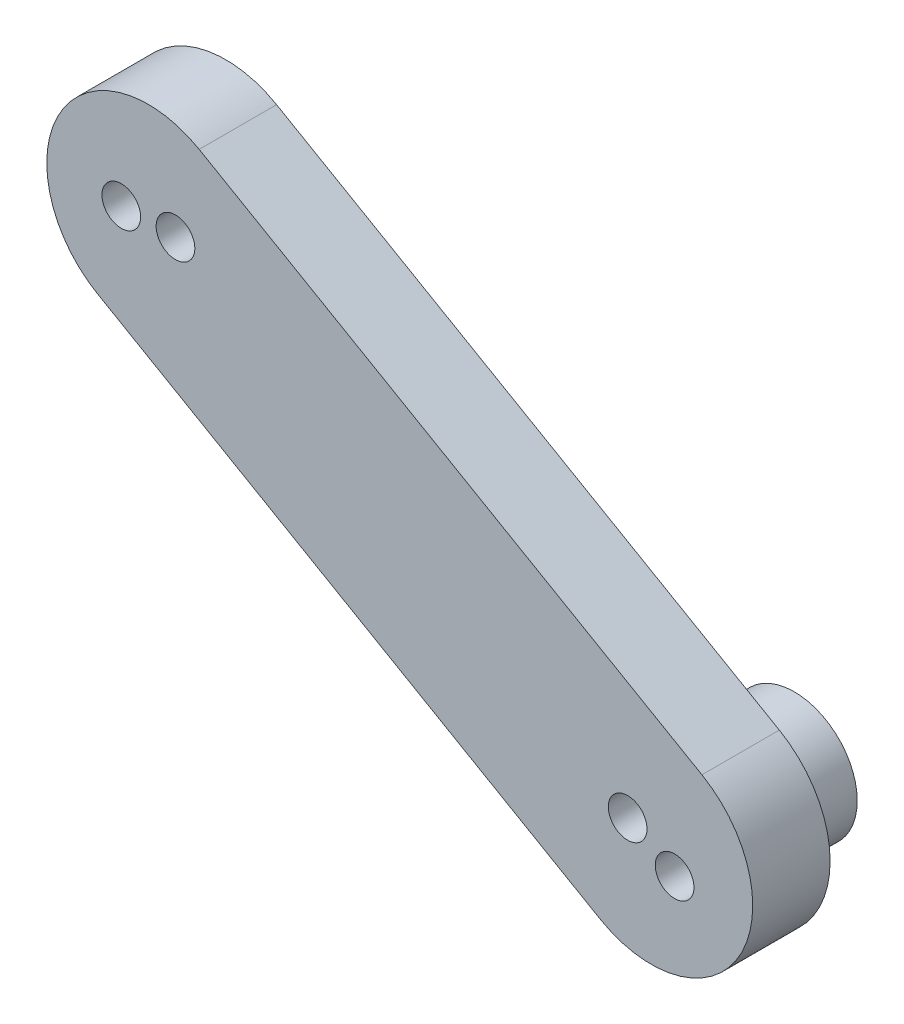
ISO-10303-21;
HEADER;
FILE_DESCRIPTION(('STEP AP214'),'2;1');
FILE_NAME('part.step','',(''),(''),'','','');
FILE_SCHEMA(('AUTOMOTIVE_DESIGN { 1 0 10303 214 1 1 1 1 }'));
ENDSEC;
DATA;
#1=APPLICATION_CONTEXT('core data for automotive mechanical design processes');
#2=APPLICATION_PROTOCOL_DEFINITION('international standard','automotive_design',2000,#1);
#3=PRODUCT_CONTEXT('',#1,'mechanical');
#4=PRODUCT('Part','Part','',(#3));
#5=PRODUCT_RELATED_PRODUCT_CATEGORY('part','',(#4));
#6=PRODUCT_DEFINITION_FORMATION('','',#4);
#7=PRODUCT_DEFINITION_CONTEXT('part definition',#1,'design');
#8=PRODUCT_DEFINITION('design','',#6,#7);
#9=PRODUCT_DEFINITION_SHAPE('','',#8);
#10=(LENGTH_UNIT() NAMED_UNIT(*) SI_UNIT(.MILLI.,.METRE.));
#11=(NAMED_UNIT(*) PLANE_ANGLE_UNIT() SI_UNIT($,.RADIAN.));
#12=(NAMED_UNIT(*) SI_UNIT($,.STERADIAN.) SOLID_ANGLE_UNIT());
#13=UNCERTAINTY_MEASURE_WITH_UNIT(LENGTH_MEASURE(1.E-05),#10,'distance_accuracy_value','');
#14=(GEOMETRIC_REPRESENTATION_CONTEXT(3) GLOBAL_UNCERTAINTY_ASSIGNED_CONTEXT((#13)) GLOBAL_UNIT_ASSIGNED_CONTEXT((#10,
#11,#12)) REPRESENTATION_CONTEXT('',''));
#15=CARTESIAN_POINT('',(0.,0.,0.));
#16=DIRECTION('',(0.,0.,1.));
#17=DIRECTION('',(1.,0.,0.));
#18=AXIS2_PLACEMENT_3D('',#15,#16,#17);
#19=CARTESIAN_POINT('',(-2.62499999999997,-4.54663336986832,4.));
#20=DIRECTION('',(0.499999999999995,0.866025403784442,0.));
#21=DIRECTION('',(-0.866025403784442,0.499999999999995,0.));
#22=AXIS2_PLACEMENT_3D('',#19,#20,#21);
#23=PLANE('',#22);
#24=DIRECTION('',(-0.866025403784442,0.499999999999995,0.));
#25=VECTOR('',#24,1.);
#26=CARTESIAN_POINT('',(-2.62499999999997,-4.54663336986832,0.));
#27=LINE('',#26,#25);
#28=CARTESIAN_POINT('',(23.3557621135333,-19.5466333698682,0.));
#29=VERTEX_POINT('',#28);
#30=CARTESIAN_POINT('',(-2.62499999999997,-4.54663336986832,0.));
#31=VERTEX_POINT('',#30);
#32=EDGE_CURVE('E126',#29,#31,#27,.T.);
#33=ORIENTED_EDGE('',*,*,#32,.F.);
#34=DIRECTION('',(0.,0.,-1.));
#35=VECTOR('',#34,1.);
#36=CARTESIAN_POINT('',(23.3557621135333,-19.5466333698682,4.));
#37=LINE('',#36,#35);
#38=CARTESIAN_POINT('',(23.3557621135333,-19.5466333698682,4.));
#39=VERTEX_POINT('',#38);
#40=EDGE_CURVE('E51',#39,#29,#37,.T.);
#41=ORIENTED_EDGE('',*,*,#40,.F.);
#42=DIRECTION('',(-0.866025403784442,0.499999999999995,0.));
#43=VECTOR('',#42,1.);
#44=CARTESIAN_POINT('',(-2.62499999999997,-4.54663336986832,4.));
#45=LINE('',#44,#43);
#46=CARTESIAN_POINT('',(-2.62499999999997,-4.54663336986832,4.));
#47=VERTEX_POINT('',#46);
#48=EDGE_CURVE('E102',#39,#47,#45,.T.);
#49=ORIENTED_EDGE('',*,*,#48,.T.);
#50=DIRECTION('',(0.,0.,-1.));
#51=VECTOR('',#50,1.);
#52=CARTESIAN_POINT('',(-2.62499999999997,-4.54663336986832,4.));
#53=LINE('',#52,#51);
#54=EDGE_CURVE('E11',#47,#31,#53,.T.);
#55=ORIENTED_EDGE('',*,*,#54,.T.);
#56=EDGE_LOOP('',(#33,#41,#49,#55));
#57=FACE_BOUND('',#56,.T.);
#58=ADVANCED_FACE('F47',(#57),#23,.F.);
#59=CARTESIAN_POINT('',(0.,0.,4.));
#60=DIRECTION('',(0.,0.,-1.));
#61=DIRECTION('',(1.,0.,0.));
#62=AXIS2_PLACEMENT_3D('',#59,#60,#61);
#63=CYLINDRICAL_SURFACE('',#62,5.25);
#64=CARTESIAN_POINT('',(0.,0.,0.));
#65=DIRECTION('',(0.,0.,1.));
#66=DIRECTION('',(1.,0.,0.));
#67=AXIS2_PLACEMENT_3D('',#64,#65,#66);
#68=CIRCLE('',#67,5.25);
#69=CARTESIAN_POINT('',(2.62499999999997,4.54663336986832,0.));
#70=VERTEX_POINT('',#69);
#71=EDGE_CURVE('E89',#70,#31,#68,.T.);
#72=ORIENTED_EDGE('',*,*,#71,.T.);
#73=ORIENTED_EDGE('',*,*,#54,.F.);
#74=CARTESIAN_POINT('',(0.,0.,4.));
#75=DIRECTION('',(0.,0.,1.));
#76=DIRECTION('',(1.,0.,0.));
#77=AXIS2_PLACEMENT_3D('',#74,#75,#76);
#78=CIRCLE('',#77,5.25);
#79=CARTESIAN_POINT('',(2.62499999999997,4.54663336986832,4.));
#80=VERTEX_POINT('',#79);
#81=EDGE_CURVE('E66',#80,#47,#78,.T.);
#82=ORIENTED_EDGE('',*,*,#81,.F.);
#83=DIRECTION('',(0.,0.,-1.));
#84=VECTOR('',#83,1.);
#85=CARTESIAN_POINT('',(2.62499999999997,4.54663336986832,4.));
#86=LINE('',#85,#84);
#87=EDGE_CURVE('E57',#80,#70,#86,.T.);
#88=ORIENTED_EDGE('',*,*,#87,.T.);
#89=EDGE_LOOP('',(#72,#73,#82,#88));
#90=FACE_BOUND('',#89,.T.);
#91=ADVANCED_FACE('F133',(#90),#63,.T.);
#92=CARTESIAN_POINT('',(2.62499999999997,4.54663336986832,4.));
#93=DIRECTION('',(-0.499999999999995,-0.866025403784442,0.));
#94=DIRECTION('',(0.866025403784442,-0.499999999999995,0.));
#95=AXIS2_PLACEMENT_3D('',#92,#93,#94);
#96=PLANE('',#95);
#97=DIRECTION('',(0.866025403784442,-0.499999999999995,0.));
#98=VECTOR('',#97,1.);
#99=CARTESIAN_POINT('',(2.62499999999997,4.54663336986832,0.));
#100=LINE('',#99,#98);
#101=CARTESIAN_POINT('',(28.6057621135332,-10.4533666301315,0.));
#102=VERTEX_POINT('',#101);
#103=EDGE_CURVE('E83',#70,#102,#100,.T.);
#104=ORIENTED_EDGE('',*,*,#103,.F.);
#105=ORIENTED_EDGE('',*,*,#87,.F.);
#106=DIRECTION('',(0.866025403784442,-0.499999999999995,0.));
#107=VECTOR('',#106,1.);
#108=CARTESIAN_POINT('',(2.62499999999997,4.54663336986832,4.));
#109=LINE('',#108,#107);
#110=CARTESIAN_POINT('',(28.6057621135332,-10.4533666301315,4.));
#111=VERTEX_POINT('',#110);
#112=EDGE_CURVE('E100',#80,#111,#109,.T.);
#113=ORIENTED_EDGE('',*,*,#112,.T.);
#114=DIRECTION('',(0.,0.,-1.));
#115=VECTOR('',#114,1.);
#116=CARTESIAN_POINT('',(28.6057621135332,-10.4533666301315,4.));
#117=LINE('',#116,#115);
#118=EDGE_CURVE('E105',#111,#102,#117,.T.);
#119=ORIENTED_EDGE('',*,*,#118,.T.);
#120=EDGE_LOOP('',(#104,#105,#113,#119));
#121=FACE_BOUND('',#120,.T.);
#122=ADVANCED_FACE('F108',(#121),#96,.F.);
#123=CARTESIAN_POINT('',(24.768326548235,-14.2999999999998,4.));
#124=DIRECTION('',(0.,0.,-1.));
#125=DIRECTION('',(1.,0.,0.));
#126=AXIS2_PLACEMENT_3D('',#123,#124,#125);
#127=CYLINDRICAL_SURFACE('',#126,0.999999999999992);
#128=CARTESIAN_POINT('',(24.768326548235,-14.2999999999998,4.));
#129=DIRECTION('',(0.,0.,1.));
#130=DIRECTION('',(1.,0.,0.));
#131=AXIS2_PLACEMENT_3D('',#128,#129,#130);
#132=CIRCLE('',#131,0.999999999999992);
#133=CARTESIAN_POINT('',(25.768326548235,-14.2999999999998,4.));
#134=VERTEX_POINT('',#133);
#135=EDGE_CURVE('E110',#134,#134,#132,.T.);
#136=ORIENTED_EDGE('',*,*,#135,.T.);
#137=EDGE_LOOP('',(#136));
#138=FACE_BOUND('',#137,.T.);
#139=CARTESIAN_POINT('',(24.768326548235,-14.2999999999998,-3.4));
#140=DIRECTION('',(0.,0.,1.));
#141=DIRECTION('',(1.,0.,0.));
#142=AXIS2_PLACEMENT_3D('',#139,#140,#141);
#143=CIRCLE('',#142,0.999999999999992);
#144=CARTESIAN_POINT('',(25.768326548235,-14.2999999999998,-3.4));
#145=VERTEX_POINT('',#144);
#146=EDGE_CURVE('E147',#145,#145,#143,.T.);
#147=ORIENTED_EDGE('',*,*,#146,.F.);
#148=EDGE_LOOP('',(#147));
#149=FACE_BOUND('',#148,.T.);
#150=ADVANCED_FACE('F159',(#138,#149),#127,.F.);
#151=CARTESIAN_POINT('',(25.9807621135332,-14.9999999999998,4.));
#152=DIRECTION('',(0.,0.,-1.));
#153=DIRECTION('',(1.,0.,0.));
#154=AXIS2_PLACEMENT_3D('',#151,#152,#153);
#155=CYLINDRICAL_SURFACE('',#154,5.25);
#156=CARTESIAN_POINT('',(25.9807621135332,-14.9999999999998,0.));
#157=DIRECTION('',(0.,0.,1.));
#158=DIRECTION('',(1.,0.,0.));
#159=AXIS2_PLACEMENT_3D('',#156,#157,#158);
#160=CIRCLE('',#159,5.25);
#161=EDGE_CURVE('E107',#29,#102,#160,.T.);
#162=ORIENTED_EDGE('',*,*,#161,.T.);
#163=ORIENTED_EDGE('',*,*,#118,.F.);
#164=CARTESIAN_POINT('',(25.9807621135332,-14.9999999999998,4.));
#165=DIRECTION('',(0.,0.,1.));
#166=DIRECTION('',(1.,0.,0.));
#167=AXIS2_PLACEMENT_3D('',#164,#165,#166);
#168=CIRCLE('',#167,5.25);
#169=EDGE_CURVE('E96',#39,#111,#168,.T.);
#170=ORIENTED_EDGE('',*,*,#169,.F.);
#171=ORIENTED_EDGE('',*,*,#40,.T.);
#172=EDGE_LOOP('',(#162,#163,#170,#171));
#173=FACE_BOUND('',#172,.T.);
#174=ADVANCED_FACE('F106',(#173),#155,.T.);
#175=CARTESIAN_POINT('',(1.40000000000002,0.,4.));
#176=DIRECTION('',(0.,0.,-1.));
#177=DIRECTION('',(1.,0.,0.));
#178=AXIS2_PLACEMENT_3D('',#175,#176,#177);
#179=CYLINDRICAL_SURFACE('',#178,1.);
#180=CARTESIAN_POINT('',(1.40000000000002,0.,4.));
#181=DIRECTION('',(0.,0.,1.));
#182=DIRECTION('',(1.,0.,0.));
#183=AXIS2_PLACEMENT_3D('',#180,#181,#182);
#184=CIRCLE('',#183,1.);
#185=CARTESIAN_POINT('',(2.40000000000002,0.,4.));
#186=VERTEX_POINT('',#185);
#187=EDGE_CURVE('E138',#186,#186,#184,.T.);
#188=ORIENTED_EDGE('',*,*,#187,.T.);
#189=EDGE_LOOP('',(#188));
#190=FACE_BOUND('',#189,.T.);
#191=CARTESIAN_POINT('',(1.40000000000002,0.,0.));
#192=DIRECTION('',(0.,0.,1.));
#193=DIRECTION('',(1.,0.,0.));
#194=AXIS2_PLACEMENT_3D('',#191,#192,#193);
#195=CIRCLE('',#194,1.);
#196=CARTESIAN_POINT('',(2.40000000000002,0.,0.));
#197=VERTEX_POINT('',#196);
#198=EDGE_CURVE('E122',#197,#197,#195,.T.);
#199=ORIENTED_EDGE('',*,*,#198,.F.);
#200=EDGE_LOOP('',(#199));
#201=FACE_BOUND('',#200,.T.);
#202=ADVANCED_FACE('F167',(#190,#201),#179,.F.);
#203=CARTESIAN_POINT('',(-1.39999999999996,0.,4.));
#204=DIRECTION('',(0.,0.,-1.));
#205=DIRECTION('',(1.,0.,0.));
#206=AXIS2_PLACEMENT_3D('',#203,#204,#205);
#207=CYLINDRICAL_SURFACE('',#206,1.);
#208=CARTESIAN_POINT('',(-1.39999999999996,0.,4.));
#209=DIRECTION('',(0.,0.,1.));
#210=DIRECTION('',(1.,0.,0.));
#211=AXIS2_PLACEMENT_3D('',#208,#209,#210);
#212=CIRCLE('',#211,1.);
#213=CARTESIAN_POINT('',(-0.39999999999996,0.,4.));
#214=VERTEX_POINT('',#213);
#215=EDGE_CURVE('E131',#214,#214,#212,.T.);
#216=ORIENTED_EDGE('',*,*,#215,.T.);
#217=EDGE_LOOP('',(#216));
#218=FACE_BOUND('',#217,.T.);
#219=CARTESIAN_POINT('',(-1.39999999999996,0.,0.));
#220=DIRECTION('',(0.,0.,1.));
#221=DIRECTION('',(1.,0.,0.));
#222=AXIS2_PLACEMENT_3D('',#219,#220,#221);
#223=CIRCLE('',#222,1.);
#224=CARTESIAN_POINT('',(-0.39999999999996,0.,0.));
#225=VERTEX_POINT('',#224);
#226=EDGE_CURVE('E119',#225,#225,#223,.T.);
#227=ORIENTED_EDGE('',*,*,#226,.F.);
#228=EDGE_LOOP('',(#227));
#229=FACE_BOUND('',#228,.T.);
#230=ADVANCED_FACE('F49',(#218,#229),#207,.F.);
#231=CARTESIAN_POINT('',(27.1931976788315,-15.6999999999998,4.));
#232=DIRECTION('',(0.,0.,-1.));
#233=DIRECTION('',(1.,0.,0.));
#234=AXIS2_PLACEMENT_3D('',#231,#232,#233);
#235=CYLINDRICAL_SURFACE('',#234,0.999999999999987);
#236=CARTESIAN_POINT('',(27.1931976788315,-15.6999999999998,4.));
#237=DIRECTION('',(0.,0.,1.));
#238=DIRECTION('',(1.,0.,0.));
#239=AXIS2_PLACEMENT_3D('',#236,#237,#238);
#240=CIRCLE('',#239,0.999999999999987);
#241=CARTESIAN_POINT('',(28.1931976788315,-15.6999999999998,4.));
#242=VERTEX_POINT('',#241);
#243=EDGE_CURVE('E116',#242,#242,#240,.T.);
#244=ORIENTED_EDGE('',*,*,#243,.T.);
#245=EDGE_LOOP('',(#244));
#246=FACE_BOUND('',#245,.T.);
#247=CARTESIAN_POINT('',(27.1931976788315,-15.6999999999998,-3.4));
#248=DIRECTION('',(0.,0.,1.));
#249=DIRECTION('',(1.,0.,0.));
#250=AXIS2_PLACEMENT_3D('',#247,#248,#249);
#251=CIRCLE('',#250,0.999999999999987);
#252=CARTESIAN_POINT('',(28.1931976788315,-15.6999999999998,-3.4));
#253=VERTEX_POINT('',#252);
#254=EDGE_CURVE('E150',#253,#253,#251,.T.);
#255=ORIENTED_EDGE('',*,*,#254,.F.);
#256=EDGE_LOOP('',(#255));
#257=FACE_BOUND('',#256,.T.);
#258=ADVANCED_FACE('F182',(#246,#257),#235,.F.);
#259=CARTESIAN_POINT('',(0.,0.,4.));
#260=DIRECTION('',(0.,0.,-1.));
#261=DIRECTION('',(1.,0.,0.));
#262=AXIS2_PLACEMENT_3D('',#259,#260,#261);
#263=PLANE('',#262);
#264=ORIENTED_EDGE('',*,*,#215,.F.);
#265=EDGE_LOOP('',(#264));
#266=FACE_BOUND('',#265,.T.);
#267=ORIENTED_EDGE('',*,*,#187,.F.);
#268=EDGE_LOOP('',(#267));
#269=FACE_BOUND('',#268,.T.);
#270=ORIENTED_EDGE('',*,*,#48,.F.);
#271=ORIENTED_EDGE('',*,*,#169,.T.);
#272=ORIENTED_EDGE('',*,*,#112,.F.);
#273=ORIENTED_EDGE('',*,*,#81,.T.);
#274=EDGE_LOOP('',(#270,#271,#272,#273));
#275=FACE_BOUND('',#274,.T.);
#276=ORIENTED_EDGE('',*,*,#135,.F.);
#277=EDGE_LOOP('',(#276));
#278=FACE_BOUND('',#277,.T.);
#279=ORIENTED_EDGE('',*,*,#243,.F.);
#280=EDGE_LOOP('',(#279));
#281=FACE_BOUND('',#280,.T.);
#282=ADVANCED_FACE('F97',(#266,#269,#275,#278,#281),#263,.F.);
#283=CARTESIAN_POINT('',(0.,0.,0.));
#284=DIRECTION('',(0.,0.,-1.));
#285=DIRECTION('',(1.,0.,0.));
#286=AXIS2_PLACEMENT_3D('',#283,#284,#285);
#287=PLANE('',#286);
#288=CARTESIAN_POINT('',(25.9807621135332,-14.9999999999998,0.));
#289=DIRECTION('',(0.,0.,1.));
#290=DIRECTION('',(1.,0.,0.));
#291=AXIS2_PLACEMENT_3D('',#288,#289,#290);
#292=CIRCLE('',#291,3.25);
#293=CARTESIAN_POINT('',(29.2307621135332,-14.9999999999998,0.));
#294=VERTEX_POINT('',#293);
#295=EDGE_CURVE('E144',#294,#294,#292,.T.);
#296=ORIENTED_EDGE('',*,*,#295,.T.);
#297=EDGE_LOOP('',(#296));
#298=FACE_BOUND('',#297,.T.);
#299=ORIENTED_EDGE('',*,*,#226,.T.);
#300=EDGE_LOOP('',(#299));
#301=FACE_BOUND('',#300,.T.);
#302=ORIENTED_EDGE('',*,*,#198,.T.);
#303=EDGE_LOOP('',(#302));
#304=FACE_BOUND('',#303,.T.);
#305=ORIENTED_EDGE('',*,*,#32,.T.);
#306=ORIENTED_EDGE('',*,*,#71,.F.);
#307=ORIENTED_EDGE('',*,*,#103,.T.);
#308=ORIENTED_EDGE('',*,*,#161,.F.);
#309=EDGE_LOOP('',(#305,#306,#307,#308));
#310=FACE_BOUND('',#309,.T.);
#311=ADVANCED_FACE('F135',(#298,#301,#304,#310),#287,.T.);
#312=CARTESIAN_POINT('',(25.9807621135332,-14.9999999999998,-3.4));
#313=DIRECTION('',(0.,0.,1.));
#314=DIRECTION('',(-1.,0.,0.));
#315=AXIS2_PLACEMENT_3D('',#312,#313,#314);
#316=CYLINDRICAL_SURFACE('',#315,3.25);
#317=CARTESIAN_POINT('',(25.9807621135332,-14.9999999999998,-3.4));
#318=DIRECTION('',(0.,0.,1.));
#319=DIRECTION('',(1.,0.,0.));
#320=AXIS2_PLACEMENT_3D('',#317,#318,#319);
#321=CIRCLE('',#320,3.25);
#322=CARTESIAN_POINT('',(29.2307621135332,-14.9999999999998,-3.4));
#323=VERTEX_POINT('',#322);
#324=EDGE_CURVE('E123',#323,#323,#321,.T.);
#325=ORIENTED_EDGE('',*,*,#324,.T.);
#326=EDGE_LOOP('',(#325));
#327=FACE_BOUND('',#326,.T.);
#328=ORIENTED_EDGE('',*,*,#295,.F.);
#329=EDGE_LOOP('',(#328));
#330=FACE_BOUND('',#329,.T.);
#331=ADVANCED_FACE('F189',(#327,#330),#316,.T.);
#332=CARTESIAN_POINT('',(0.,0.,-3.4));
#333=DIRECTION('',(0.,0.,-1.));
#334=DIRECTION('',(1.,0.,0.));
#335=AXIS2_PLACEMENT_3D('',#332,#333,#334);
#336=PLANE('',#335);
#337=ORIENTED_EDGE('',*,*,#146,.T.);
#338=EDGE_LOOP('',(#337));
#339=FACE_BOUND('',#338,.T.);
#340=ORIENTED_EDGE('',*,*,#254,.T.);
#341=EDGE_LOOP('',(#340));
#342=FACE_BOUND('',#341,.T.);
#343=ORIENTED_EDGE('',*,*,#324,.F.);
#344=EDGE_LOOP('',(#343));
#345=FACE_BOUND('',#344,.T.);
#346=ADVANCED_FACE('F156',(#339,#342,#345),#336,.T.);
#347=CLOSED_SHELL('',(#58,#91,#122,#150,#174,#202,#230,#258,#282,#311,#331,#346));
#348=MANIFOLD_SOLID_BREP('B2',#347);
#349=ADVANCED_BREP_SHAPE_REPRESENTATION('',(#18,#348),#14);
#350=SHAPE_DEFINITION_REPRESENTATION(#9,#349);
ENDSEC;
END-ISO-10303-21;
